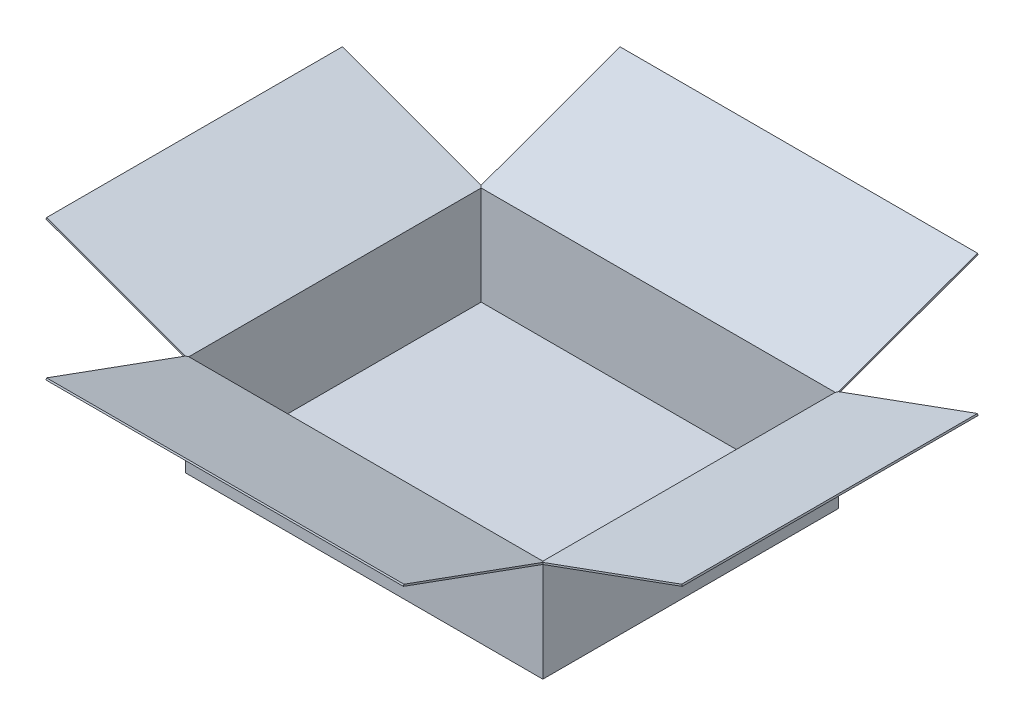
ISO-10303-21;
HEADER;
FILE_DESCRIPTION(('STEP AP214'),'2;1');
FILE_NAME('part.step','',(''),(''),'','','');
FILE_SCHEMA(('AUTOMOTIVE_DESIGN { 1 0 10303 214 1 1 1 1 }'));
ENDSEC;
DATA;
#1=APPLICATION_CONTEXT('core data for automotive mechanical design processes');
#2=APPLICATION_PROTOCOL_DEFINITION('international standard','automotive_design',2000,#1);
#3=PRODUCT_CONTEXT('',#1,'mechanical');
#4=PRODUCT('Part','Part','',(#3));
#5=PRODUCT_RELATED_PRODUCT_CATEGORY('part','',(#4));
#6=PRODUCT_DEFINITION_FORMATION('','',#4);
#7=PRODUCT_DEFINITION_CONTEXT('part definition',#1,'design');
#8=PRODUCT_DEFINITION('design','',#6,#7);
#9=PRODUCT_DEFINITION_SHAPE('','',#8);
#10=(LENGTH_UNIT() NAMED_UNIT(*) SI_UNIT(.MILLI.,.METRE.));
#11=(NAMED_UNIT(*) PLANE_ANGLE_UNIT() SI_UNIT($,.RADIAN.));
#12=(NAMED_UNIT(*) SI_UNIT($,.STERADIAN.) SOLID_ANGLE_UNIT());
#13=UNCERTAINTY_MEASURE_WITH_UNIT(LENGTH_MEASURE(1.E-05),#10,'distance_accuracy_value','');
#14=(GEOMETRIC_REPRESENTATION_CONTEXT(3) GLOBAL_UNCERTAINTY_ASSIGNED_CONTEXT((#13)) GLOBAL_UNIT_ASSIGNED_CONTEXT((#10,
#11,#12)) REPRESENTATION_CONTEXT('',''));
#15=CARTESIAN_POINT('',(0.,0.,0.));
#16=DIRECTION('',(0.,0.,1.));
#17=DIRECTION('',(1.,0.,0.));
#18=AXIS2_PLACEMENT_3D('',#15,#16,#17);
#19=CARTESIAN_POINT('',(-211.5,119.,175.));
#20=DIRECTION('',(1.,0.,0.));
#21=DIRECTION('',(0.,0.,-1.));
#22=AXIS2_PLACEMENT_3D('',#19,#20,#21);
#23=PLANE('',#22);
#24=DIRECTION('',(0.,0.,1.));
#25=VECTOR('',#24,1.);
#26=CARTESIAN_POINT('',(-211.5,117.599584923581,175.));
#27=LINE('',#26,#25);
#28=CARTESIAN_POINT('',(-211.5,117.599584923581,-175.));
#29=VERTEX_POINT('',#28);
#30=CARTESIAN_POINT('',(-211.5,117.599584923581,175.));
#31=VERTEX_POINT('',#30);
#32=EDGE_CURVE('E203',#29,#31,#27,.T.);
#33=ORIENTED_EDGE('',*,*,#32,.F.);
#34=DIRECTION('',(0.,-1.,0.));
#35=VECTOR('',#34,1.);
#36=CARTESIAN_POINT('',(-211.5,119.,-175.));
#37=LINE('',#36,#35);
#38=CARTESIAN_POINT('',(-211.5,0.,-175.));
#39=VERTEX_POINT('',#38);
#40=EDGE_CURVE('E320',#29,#39,#37,.T.);
#41=ORIENTED_EDGE('',*,*,#40,.T.);
#42=DIRECTION('',(0.,0.,1.));
#43=VECTOR('',#42,1.);
#44=CARTESIAN_POINT('',(-211.5,0.,175.));
#45=LINE('',#44,#43);
#46=CARTESIAN_POINT('',(-211.5,0.,175.));
#47=VERTEX_POINT('',#46);
#48=EDGE_CURVE('E312',#39,#47,#45,.T.);
#49=ORIENTED_EDGE('',*,*,#48,.T.);
#50=DIRECTION('',(0.,-1.,0.));
#51=VECTOR('',#50,1.);
#52=CARTESIAN_POINT('',(-211.5,119.,175.));
#53=LINE('',#52,#51);
#54=EDGE_CURVE('E318',#31,#47,#53,.T.);
#55=ORIENTED_EDGE('',*,*,#54,.F.);
#56=EDGE_LOOP('',(#33,#41,#49,#55));
#57=FACE_BOUND('',#56,.T.);
#58=ADVANCED_FACE('F36',(#57),#23,.F.);
#59=DIRECTION('',(0.,1.,0.));
#60=VECTOR('',#59,1.);
#61=CARTESIAN_POINT('',(-211.5,119.,175.));
#62=LINE('',#61,#60);
#63=CARTESIAN_POINT('',(-211.5,119.727940468532,175.));
#64=VERTEX_POINT('',#63);
#65=EDGE_CURVE('E200',#31,#64,#62,.T.);
#66=ORIENTED_EDGE('',*,*,#65,.F.);
#67=DIRECTION('',(0.,0.342020143325666,0.93969262078591));
#68=VECTOR('',#67,1.);
#69=CARTESIAN_POINT('',(-211.5,177.658180127071,340.009634165757));
#70=LINE('',#69,#68);
#71=CARTESIAN_POINT('',(-211.5,177.658180127071,340.009634165757));
#72=VERTEX_POINT('',#71);
#73=EDGE_CURVE('E258',#31,#72,#70,.T.);
#74=ORIENTED_EDGE('',*,*,#73,.T.);
#75=DIRECTION('',(0.,0.939692620785924,-0.342020143325626));
#76=VECTOR('',#75,1.);
#77=CARTESIAN_POINT('',(-211.5,179.537565368643,339.325593879106));
#78=LINE('',#77,#76);
#79=CARTESIAN_POINT('',(-211.5,179.537565368643,339.325593879106));
#80=VERTEX_POINT('',#79);
#81=EDGE_CURVE('E256',#72,#80,#78,.T.);
#82=ORIENTED_EDGE('',*,*,#81,.T.);
#83=DIRECTION('',(0.,-0.342020143325665,-0.93969262078591));
#84=VECTOR('',#83,1.);
#85=CARTESIAN_POINT('',(-211.5,119.,173.));
#86=LINE('',#85,#84);
#87=EDGE_CURVE('E261',#80,#64,#86,.T.);
#88=ORIENTED_EDGE('',*,*,#87,.T.);
#89=EDGE_LOOP('',(#66,#74,#82,#88));
#90=FACE_BOUND('',#89,.T.);
#91=ADVANCED_FACE('F424',(#90),#23,.F.);
#92=CARTESIAN_POINT('',(-389.792158065513,119.,173.));
#93=DIRECTION('',(0.,0.93969262078591,-0.342020143325665));
#94=DIRECTION('',(0.,0.342020143325665,0.93969262078591));
#95=AXIS2_PLACEMENT_3D('',#92,#93,#94);
#96=PLANE('',#95);
#97=DIRECTION('',(1.,0.,0.));
#98=VECTOR('',#97,1.);
#99=CARTESIAN_POINT('',(0.,119.,173.));
#100=LINE('',#99,#98);
#101=CARTESIAN_POINT('',(-209.5,119.,173.));
#102=VERTEX_POINT('',#101);
#103=CARTESIAN_POINT('',(209.5,119.,173.));
#104=VERTEX_POINT('',#103);
#105=EDGE_CURVE('E287',#102,#104,#100,.T.);
#106=ORIENTED_EDGE('',*,*,#105,.F.);
#107=DIRECTION('',(-0.684791078771737,0.249243569363952,0.684791078771736));
#108=VECTOR('',#107,1.);
#109=CARTESIAN_POINT('',(-294.045992140717,149.772224565725,257.545992140717));
#110=LINE('',#109,#108);
#111=EDGE_CURVE('E51',#102,#64,#110,.T.);
#112=ORIENTED_EDGE('',*,*,#111,.T.);
#113=ORIENTED_EDGE('',*,*,#87,.F.);
#114=DIRECTION('',(1.,0.,0.));
#115=VECTOR('',#114,1.);
#116=CARTESIAN_POINT('',(-389.792158065513,179.537565368643,339.325593879106));
#117=LINE('',#116,#115);
#118=CARTESIAN_POINT('',(211.5,179.537565368643,339.325593879106));
#119=VERTEX_POINT('',#118);
#120=EDGE_CURVE('E269',#80,#119,#117,.T.);
#121=ORIENTED_EDGE('',*,*,#120,.T.);
#122=DIRECTION('',(0.,0.342020143325665,0.93969262078591));
#123=VECTOR('',#122,1.);
#124=CARTESIAN_POINT('',(211.5,119.,173.));
#125=LINE('',#124,#123);
#126=CARTESIAN_POINT('',(211.499999999999,119.727940468532,175.));
#127=VERTEX_POINT('',#126);
#128=EDGE_CURVE('E255',#127,#119,#125,.T.);
#129=ORIENTED_EDGE('',*,*,#128,.F.);
#130=DIRECTION('',(0.684791078771737,0.249243569363952,0.684791078771736));
#131=VECTOR('',#130,1.);
#132=CARTESIAN_POINT('',(-71.5313583766025,16.7129506555201,-108.031358376602));
#133=LINE('',#132,#131);
#134=EDGE_CURVE('E326',#104,#127,#133,.T.);
#135=ORIENTED_EDGE('',*,*,#134,.F.);
#136=EDGE_LOOP('',(#106,#112,#113,#121,#129,#135));
#137=FACE_BOUND('',#136,.T.);
#138=ADVANCED_FACE('F350',(#137),#96,.T.);
#139=CARTESIAN_POINT('',(-389.792158065513,119.,-173.));
#140=DIRECTION('',(0.,-0.93969262078591,-0.342020143325665));
#141=DIRECTION('',(0.,0.342020143325665,-0.93969262078591));
#142=AXIS2_PLACEMENT_3D('',#139,#140,#141);
#143=PLANE('',#142);
#144=DIRECTION('',(-0.684791078771737,0.249243569363952,-0.684791078771736));
#145=VECTOR('',#144,1.);
#146=CARTESIAN_POINT('',(-294.045992140717,149.772224565725,-257.545992140717));
#147=LINE('',#146,#145);
#148=CARTESIAN_POINT('',(-209.5,119.,-173.));
#149=VERTEX_POINT('',#148);
#150=CARTESIAN_POINT('',(-211.5,119.727940468532,-175.));
#151=VERTEX_POINT('',#150);
#152=EDGE_CURVE('E11',#149,#151,#147,.T.);
#153=ORIENTED_EDGE('',*,*,#152,.F.);
#154=DIRECTION('',(-1.,0.,0.));
#155=VECTOR('',#154,1.);
#156=CARTESIAN_POINT('',(0.,119.,-173.));
#157=LINE('',#156,#155);
#158=CARTESIAN_POINT('',(209.5,119.,-173.));
#159=VERTEX_POINT('',#158);
#160=EDGE_CURVE('E300',#159,#149,#157,.T.);
#161=ORIENTED_EDGE('',*,*,#160,.F.);
#162=DIRECTION('',(-0.684791078771737,-0.249243569363952,0.684791078771736));
#163=VECTOR('',#162,1.);
#164=CARTESIAN_POINT('',(-37.2988244023312,29.1725740656612,73.7988244023313));
#165=LINE('',#164,#163);
#166=CARTESIAN_POINT('',(211.5,119.727940468532,-175.));
#167=VERTEX_POINT('',#166);
#168=EDGE_CURVE('E44',#167,#159,#165,.T.);
#169=ORIENTED_EDGE('',*,*,#168,.F.);
#170=DIRECTION('',(0.,0.342020143325665,-0.93969262078591));
#171=VECTOR('',#170,1.);
#172=CARTESIAN_POINT('',(211.5,119.,-173.));
#173=LINE('',#172,#171);
#174=CARTESIAN_POINT('',(211.5,179.537565368643,-339.325593879106));
#175=VERTEX_POINT('',#174);
#176=EDGE_CURVE('E218',#167,#175,#173,.T.);
#177=ORIENTED_EDGE('',*,*,#176,.T.);
#178=DIRECTION('',(1.,0.,0.));
#179=VECTOR('',#178,1.);
#180=CARTESIAN_POINT('',(-389.792158065513,179.537565368643,-339.325593879106));
#181=LINE('',#180,#179);
#182=CARTESIAN_POINT('',(-211.5,179.537565368643,-339.325593879106));
#183=VERTEX_POINT('',#182);
#184=EDGE_CURVE('E221',#183,#175,#181,.T.);
#185=ORIENTED_EDGE('',*,*,#184,.F.);
#186=DIRECTION('',(0.,-0.342020143325665,0.93969262078591));
#187=VECTOR('',#186,1.);
#188=CARTESIAN_POINT('',(-211.5,119.,-173.));
#189=LINE('',#188,#187);
#190=EDGE_CURVE('E209',#183,#151,#189,.T.);
#191=ORIENTED_EDGE('',*,*,#190,.T.);
#192=EDGE_LOOP('',(#153,#161,#169,#177,#185,#191));
#193=FACE_BOUND('',#192,.T.);
#194=ADVANCED_FACE('F408',(#193),#143,.F.);
#195=CARTESIAN_POINT('',(-211.5,119.,-175.));
#196=DIRECTION('',(0.,0.,1.));
#197=DIRECTION('',(1.,0.,0.));
#198=AXIS2_PLACEMENT_3D('',#195,#196,#197);
#199=PLANE('',#198);
#200=ORIENTED_EDGE('',*,*,#40,.F.);
#201=DIRECTION('',(-1.,0.,0.));
#202=VECTOR('',#201,1.);
#203=CARTESIAN_POINT('',(-211.5,117.599584923581,-175.));
#204=LINE('',#203,#202);
#205=CARTESIAN_POINT('',(211.5,117.599584923581,-175.));
#206=VERTEX_POINT('',#205);
#207=EDGE_CURVE('E228',#206,#29,#204,.T.);
#208=ORIENTED_EDGE('',*,*,#207,.F.);
#209=DIRECTION('',(0.,-1.,0.));
#210=VECTOR('',#209,1.);
#211=CARTESIAN_POINT('',(211.5,119.,-175.));
#212=LINE('',#211,#210);
#213=CARTESIAN_POINT('',(211.5,0.,-175.));
#214=VERTEX_POINT('',#213);
#215=EDGE_CURVE('E322',#206,#214,#212,.T.);
#216=ORIENTED_EDGE('',*,*,#215,.T.);
#217=DIRECTION('',(-1.,0.,0.));
#218=VECTOR('',#217,1.);
#219=CARTESIAN_POINT('',(-211.5,0.,-175.));
#220=LINE('',#219,#218);
#221=EDGE_CURVE('E309',#214,#39,#220,.T.);
#222=ORIENTED_EDGE('',*,*,#221,.T.);
#223=EDGE_LOOP('',(#200,#208,#216,#222));
#224=FACE_BOUND('',#223,.T.);
#225=ADVANCED_FACE('F390',(#224),#199,.F.);
#226=CARTESIAN_POINT('',(209.5,119.,353.292158065513));
#227=DIRECTION('',(-0.342020143325665,0.93969262078591,0.));
#228=DIRECTION('',(-0.93969262078591,-0.342020143325665,0.));
#229=AXIS2_PLACEMENT_3D('',#226,#227,#228);
#230=PLANE('',#229);
#231=DIRECTION('',(0.93969262078591,0.342020143325665,0.));
#232=VECTOR('',#231,1.);
#233=CARTESIAN_POINT('',(209.5,119.,-175.));
#234=LINE('',#233,#232);
#235=CARTESIAN_POINT('',(375.825593879106,179.537565368643,-175.));
#236=VERTEX_POINT('',#235);
#237=EDGE_CURVE('E230',#167,#236,#234,.T.);
#238=ORIENTED_EDGE('',*,*,#237,.F.);
#239=ORIENTED_EDGE('',*,*,#168,.T.);
#240=DIRECTION('',(0.,0.,-1.));
#241=VECTOR('',#240,1.);
#242=CARTESIAN_POINT('',(209.5,119.,0.));
#243=LINE('',#242,#241);
#244=EDGE_CURVE('E297',#104,#159,#243,.T.);
#245=ORIENTED_EDGE('',*,*,#244,.F.);
#246=ORIENTED_EDGE('',*,*,#134,.T.);
#247=DIRECTION('',(-0.93969262078591,-0.342020143325665,0.));
#248=VECTOR('',#247,1.);
#249=CARTESIAN_POINT('',(209.5,119.,175.));
#250=LINE('',#249,#248);
#251=CARTESIAN_POINT('',(375.825593879106,179.537565368643,175.));
#252=VERTEX_POINT('',#251);
#253=EDGE_CURVE('E236',#252,#127,#250,.T.);
#254=ORIENTED_EDGE('',*,*,#253,.F.);
#255=DIRECTION('',(0.,0.,-1.));
#256=VECTOR('',#255,1.);
#257=CARTESIAN_POINT('',(375.825593879106,179.537565368643,353.292158065513));
#258=LINE('',#257,#256);
#259=EDGE_CURVE('E244',#252,#236,#258,.T.);
#260=ORIENTED_EDGE('',*,*,#259,.T.);
#261=EDGE_LOOP('',(#238,#239,#245,#246,#254,#260));
#262=FACE_BOUND('',#261,.T.);
#263=ADVANCED_FACE('F332',(#262),#230,.T.);
#264=CARTESIAN_POINT('',(211.5,119.,175.));
#265=DIRECTION('',(-1.,0.,0.));
#266=DIRECTION('',(0.,0.,1.));
#267=AXIS2_PLACEMENT_3D('',#264,#265,#266);
#268=PLANE('',#267);
#269=DIRECTION('',(0.,-1.,0.));
#270=VECTOR('',#269,1.);
#271=CARTESIAN_POINT('',(211.5,119.,175.));
#272=LINE('',#271,#270);
#273=CARTESIAN_POINT('',(211.5,117.599584923581,175.));
#274=VERTEX_POINT('',#273);
#275=EDGE_CURVE('E250',#127,#274,#272,.T.);
#276=ORIENTED_EDGE('',*,*,#275,.F.);
#277=ORIENTED_EDGE('',*,*,#128,.T.);
#278=DIRECTION('',(0.,-0.939692620785924,0.342020143325626));
#279=VECTOR('',#278,1.);
#280=CARTESIAN_POINT('',(211.5,179.537565368643,339.325593879106));
#281=LINE('',#280,#279);
#282=CARTESIAN_POINT('',(211.5,177.658180127071,340.009634165757));
#283=VERTEX_POINT('',#282);
#284=EDGE_CURVE('E263',#119,#283,#281,.T.);
#285=ORIENTED_EDGE('',*,*,#284,.T.);
#286=DIRECTION('',(0.,-0.342020143325666,-0.93969262078591));
#287=VECTOR('',#286,1.);
#288=CARTESIAN_POINT('',(211.5,177.658180127071,340.009634165757));
#289=LINE('',#288,#287);
#290=EDGE_CURVE('E266',#283,#274,#289,.T.);
#291=ORIENTED_EDGE('',*,*,#290,.T.);
#292=EDGE_LOOP('',(#276,#277,#285,#291));
#293=FACE_BOUND('',#292,.T.);
#294=ADVANCED_FACE('F379',(#293),#268,.F.);
#295=ORIENTED_EDGE('',*,*,#215,.F.);
#296=DIRECTION('',(0.,0.,1.));
#297=VECTOR('',#296,1.);
#298=CARTESIAN_POINT('',(211.5,117.599584923581,175.));
#299=LINE('',#298,#297);
#300=EDGE_CURVE('E253',#206,#274,#299,.T.);
#301=ORIENTED_EDGE('',*,*,#300,.T.);
#302=DIRECTION('',(0.,-1.,0.));
#303=VECTOR('',#302,1.);
#304=CARTESIAN_POINT('',(211.5,119.,175.));
#305=LINE('',#304,#303);
#306=CARTESIAN_POINT('',(211.5,0.,175.));
#307=VERTEX_POINT('',#306);
#308=EDGE_CURVE('E59',#274,#307,#305,.T.);
#309=ORIENTED_EDGE('',*,*,#308,.T.);
#310=DIRECTION('',(0.,0.,-1.));
#311=VECTOR('',#310,1.);
#312=CARTESIAN_POINT('',(211.5,0.,175.));
#313=LINE('',#312,#311);
#314=EDGE_CURVE('E281',#307,#214,#313,.T.);
#315=ORIENTED_EDGE('',*,*,#314,.T.);
#316=EDGE_LOOP('',(#295,#301,#309,#315));
#317=FACE_BOUND('',#316,.T.);
#318=ADVANCED_FACE('F38',(#317),#268,.F.);
#319=DIRECTION('',(-0.93969262078591,-0.342020143325666,0.));
#320=VECTOR('',#319,1.);
#321=CARTESIAN_POINT('',(376.509634165757,177.658180127071,-175.));
#322=LINE('',#321,#320);
#323=CARTESIAN_POINT('',(376.509634165757,177.658180127071,-175.));
#324=VERTEX_POINT('',#323);
#325=EDGE_CURVE('E241',#324,#206,#322,.T.);
#326=ORIENTED_EDGE('',*,*,#325,.T.);
#327=DIRECTION('',(0.,1.,0.));
#328=VECTOR('',#327,1.);
#329=CARTESIAN_POINT('',(211.5,119.,-175.));
#330=LINE('',#329,#328);
#331=EDGE_CURVE('E212',#206,#167,#330,.T.);
#332=ORIENTED_EDGE('',*,*,#331,.T.);
#333=ORIENTED_EDGE('',*,*,#237,.T.);
#334=DIRECTION('',(0.342020143325664,-0.93969262078591,0.));
#335=VECTOR('',#334,1.);
#336=CARTESIAN_POINT('',(375.825593879106,179.537565368643,-175.));
#337=LINE('',#336,#335);
#338=EDGE_CURVE('E238',#236,#324,#337,.T.);
#339=ORIENTED_EDGE('',*,*,#338,.T.);
#340=EDGE_LOOP('',(#326,#332,#333,#339));
#341=FACE_BOUND('',#340,.T.);
#342=ADVANCED_FACE('F364',(#341),#199,.F.);
#343=DIRECTION('',(0.,0.342020143325666,-0.93969262078591));
#344=VECTOR('',#343,1.);
#345=CARTESIAN_POINT('',(-211.5,177.658180127071,-340.009634165757));
#346=LINE('',#345,#344);
#347=CARTESIAN_POINT('',(-211.5,177.658180127071,-340.009634165757));
#348=VERTEX_POINT('',#347);
#349=EDGE_CURVE('E210',#29,#348,#346,.T.);
#350=ORIENTED_EDGE('',*,*,#349,.F.);
#351=DIRECTION('',(0.,1.,0.));
#352=VECTOR('',#351,1.);
#353=CARTESIAN_POINT('',(-211.5,119.,-175.));
#354=LINE('',#353,#352);
#355=EDGE_CURVE('E188',#29,#151,#354,.T.);
#356=ORIENTED_EDGE('',*,*,#355,.T.);
#357=ORIENTED_EDGE('',*,*,#190,.F.);
#358=DIRECTION('',(0.,0.939692620785924,0.342020143325626));
#359=VECTOR('',#358,1.);
#360=CARTESIAN_POINT('',(-211.5,179.537565368643,-339.325593879106));
#361=LINE('',#360,#359);
#362=EDGE_CURVE('E206',#348,#183,#361,.T.);
#363=ORIENTED_EDGE('',*,*,#362,.F.);
#364=EDGE_LOOP('',(#350,#356,#357,#363));
#365=FACE_BOUND('',#364,.T.);
#366=ADVANCED_FACE('F400',(#365),#23,.F.);
#367=CARTESIAN_POINT('',(-211.5,119.,175.));
#368=DIRECTION('',(0.,0.,-1.));
#369=DIRECTION('',(-1.,0.,0.));
#370=AXIS2_PLACEMENT_3D('',#367,#368,#369);
#371=PLANE('',#370);
#372=DIRECTION('',(-1.,0.,0.));
#373=VECTOR('',#372,1.);
#374=CARTESIAN_POINT('',(-211.5,117.599584923581,175.));
#375=LINE('',#374,#373);
#376=EDGE_CURVE('E324',#274,#31,#375,.T.);
#377=ORIENTED_EDGE('',*,*,#376,.T.);
#378=ORIENTED_EDGE('',*,*,#54,.T.);
#379=DIRECTION('',(1.,0.,0.));
#380=VECTOR('',#379,1.);
#381=CARTESIAN_POINT('',(-211.5,0.,175.));
#382=LINE('',#381,#380);
#383=EDGE_CURVE('E315',#47,#307,#382,.T.);
#384=ORIENTED_EDGE('',*,*,#383,.T.);
#385=ORIENTED_EDGE('',*,*,#308,.F.);
#386=EDGE_LOOP('',(#377,#378,#384,#385));
#387=FACE_BOUND('',#386,.T.);
#388=ADVANCED_FACE('F381',(#387),#371,.F.);
#389=CARTESIAN_POINT('',(0.,0.,0.));
#390=DIRECTION('',(0.,-1.,0.));
#391=DIRECTION('',(0.,0.,-1.));
#392=AXIS2_PLACEMENT_3D('',#389,#390,#391);
#393=PLANE('',#392);
#394=ORIENTED_EDGE('',*,*,#314,.F.);
#395=ORIENTED_EDGE('',*,*,#383,.F.);
#396=ORIENTED_EDGE('',*,*,#48,.F.);
#397=ORIENTED_EDGE('',*,*,#221,.F.);
#398=EDGE_LOOP('',(#394,#395,#396,#397));
#399=FACE_BOUND('',#398,.T.);
#400=ADVANCED_FACE('F387',(#399),#393,.T.);
#401=CARTESIAN_POINT('',(209.5,119.,175.));
#402=DIRECTION('',(-1.,0.,0.));
#403=DIRECTION('',(0.,0.,1.));
#404=AXIS2_PLACEMENT_3D('',#401,#402,#403);
#405=PLANE('',#404);
#406=DIRECTION('',(0.,0.,-1.));
#407=VECTOR('',#406,1.);
#408=CARTESIAN_POINT('',(209.5,2.,0.));
#409=LINE('',#408,#407);
#410=CARTESIAN_POINT('',(209.5,2.,173.));
#411=VERTEX_POINT('',#410);
#412=CARTESIAN_POINT('',(209.5,2.,-173.));
#413=VERTEX_POINT('',#412);
#414=EDGE_CURVE('E274',#411,#413,#409,.T.);
#415=ORIENTED_EDGE('',*,*,#414,.F.);
#416=DIRECTION('',(0.,-1.,0.));
#417=VECTOR('',#416,1.);
#418=CARTESIAN_POINT('',(209.5,119.,173.));
#419=LINE('',#418,#417);
#420=EDGE_CURVE('E283',#104,#411,#419,.T.);
#421=ORIENTED_EDGE('',*,*,#420,.F.);
#422=ORIENTED_EDGE('',*,*,#244,.T.);
#423=DIRECTION('',(0.,-1.,0.));
#424=VECTOR('',#423,1.);
#425=CARTESIAN_POINT('',(209.5,119.,-173.));
#426=LINE('',#425,#424);
#427=EDGE_CURVE('E278',#159,#413,#426,.T.);
#428=ORIENTED_EDGE('',*,*,#427,.T.);
#429=EDGE_LOOP('',(#415,#421,#422,#428));
#430=FACE_BOUND('',#429,.T.);
#431=ADVANCED_FACE('F339',(#430),#405,.T.);
#432=CARTESIAN_POINT('',(-211.5,119.,-173.));
#433=DIRECTION('',(0.,0.,1.));
#434=DIRECTION('',(1.,0.,0.));
#435=AXIS2_PLACEMENT_3D('',#432,#433,#434);
#436=PLANE('',#435);
#437=DIRECTION('',(-1.,0.,0.));
#438=VECTOR('',#437,1.);
#439=CARTESIAN_POINT('',(0.,2.,-173.));
#440=LINE('',#439,#438);
#441=CARTESIAN_POINT('',(-209.5,2.,-173.));
#442=VERTEX_POINT('',#441);
#443=EDGE_CURVE('E277',#413,#442,#440,.T.);
#444=ORIENTED_EDGE('',*,*,#443,.F.);
#445=ORIENTED_EDGE('',*,*,#427,.F.);
#446=ORIENTED_EDGE('',*,*,#160,.T.);
#447=DIRECTION('',(0.,-1.,0.));
#448=VECTOR('',#447,1.);
#449=CARTESIAN_POINT('',(-209.5,119.,-173.));
#450=LINE('',#449,#448);
#451=EDGE_CURVE('E282',#149,#442,#450,.T.);
#452=ORIENTED_EDGE('',*,*,#451,.T.);
#453=EDGE_LOOP('',(#444,#445,#446,#452));
#454=FACE_BOUND('',#453,.T.);
#455=ADVANCED_FACE('F341',(#454),#436,.T.);
#456=CARTESIAN_POINT('',(-209.5,119.,175.));
#457=DIRECTION('',(1.,0.,0.));
#458=DIRECTION('',(0.,0.,-1.));
#459=AXIS2_PLACEMENT_3D('',#456,#457,#458);
#460=PLANE('',#459);
#461=DIRECTION('',(0.,0.,1.));
#462=VECTOR('',#461,1.);
#463=CARTESIAN_POINT('',(-209.5,2.,0.));
#464=LINE('',#463,#462);
#465=CARTESIAN_POINT('',(-209.5,2.,173.));
#466=VERTEX_POINT('',#465);
#467=EDGE_CURVE('E289',#442,#466,#464,.T.);
#468=ORIENTED_EDGE('',*,*,#467,.F.);
#469=ORIENTED_EDGE('',*,*,#451,.F.);
#470=DIRECTION('',(0.,0.,1.));
#471=VECTOR('',#470,1.);
#472=CARTESIAN_POINT('',(-209.5,119.,0.));
#473=LINE('',#472,#471);
#474=EDGE_CURVE('E303',#149,#102,#473,.T.);
#475=ORIENTED_EDGE('',*,*,#474,.T.);
#476=DIRECTION('',(0.,-1.,0.));
#477=VECTOR('',#476,1.);
#478=CARTESIAN_POINT('',(-209.5,119.,173.));
#479=LINE('',#478,#477);
#480=EDGE_CURVE('E286',#102,#466,#479,.T.);
#481=ORIENTED_EDGE('',*,*,#480,.T.);
#482=EDGE_LOOP('',(#468,#469,#475,#481));
#483=FACE_BOUND('',#482,.T.);
#484=ADVANCED_FACE('F414',(#483),#460,.T.);
#485=CARTESIAN_POINT('',(-211.5,119.,173.));
#486=DIRECTION('',(0.,0.,-1.));
#487=DIRECTION('',(-1.,0.,0.));
#488=AXIS2_PLACEMENT_3D('',#485,#486,#487);
#489=PLANE('',#488);
#490=DIRECTION('',(1.,0.,0.));
#491=VECTOR('',#490,1.);
#492=CARTESIAN_POINT('',(0.,2.,173.));
#493=LINE('',#492,#491);
#494=EDGE_CURVE('E293',#466,#411,#493,.T.);
#495=ORIENTED_EDGE('',*,*,#494,.F.);
#496=ORIENTED_EDGE('',*,*,#480,.F.);
#497=ORIENTED_EDGE('',*,*,#105,.T.);
#498=ORIENTED_EDGE('',*,*,#420,.T.);
#499=EDGE_LOOP('',(#495,#496,#497,#498));
#500=FACE_BOUND('',#499,.T.);
#501=ADVANCED_FACE('F349',(#500),#489,.T.);
#502=CARTESIAN_POINT('',(0.,2.,0.));
#503=DIRECTION('',(0.,-1.,0.));
#504=DIRECTION('',(0.,0.,-1.));
#505=AXIS2_PLACEMENT_3D('',#502,#503,#504);
#506=PLANE('',#505);
#507=ORIENTED_EDGE('',*,*,#414,.T.);
#508=ORIENTED_EDGE('',*,*,#443,.T.);
#509=ORIENTED_EDGE('',*,*,#467,.T.);
#510=ORIENTED_EDGE('',*,*,#494,.T.);
#511=EDGE_LOOP('',(#507,#508,#509,#510));
#512=FACE_BOUND('',#511,.T.);
#513=ADVANCED_FACE('F345',(#512),#506,.F.);
#514=CARTESIAN_POINT('',(-389.792158065513,177.658180127071,340.009634165757));
#515=DIRECTION('',(0.,-0.93969262078591,0.342020143325666));
#516=DIRECTION('',(0.,-0.342020143325666,-0.93969262078591));
#517=AXIS2_PLACEMENT_3D('',#514,#515,#516);
#518=PLANE('',#517);
#519=ORIENTED_EDGE('',*,*,#376,.F.);
#520=ORIENTED_EDGE('',*,*,#290,.F.);
#521=DIRECTION('',(1.,0.,0.));
#522=VECTOR('',#521,1.);
#523=CARTESIAN_POINT('',(-389.792158065513,177.658180127071,340.009634165757));
#524=LINE('',#523,#522);
#525=EDGE_CURVE('E259',#72,#283,#524,.T.);
#526=ORIENTED_EDGE('',*,*,#525,.F.);
#527=ORIENTED_EDGE('',*,*,#73,.F.);
#528=EDGE_LOOP('',(#519,#520,#526,#527));
#529=FACE_BOUND('',#528,.T.);
#530=ADVANCED_FACE('F373',(#529),#518,.T.);
#531=CARTESIAN_POINT('',(-389.792158065513,179.537565368643,339.325593879106));
#532=DIRECTION('',(0.,0.342020143325626,0.939692620785924));
#533=DIRECTION('',(0.,-0.939692620785924,0.342020143325626));
#534=AXIS2_PLACEMENT_3D('',#531,#532,#533);
#535=PLANE('',#534);
#536=ORIENTED_EDGE('',*,*,#81,.F.);
#537=ORIENTED_EDGE('',*,*,#525,.T.);
#538=ORIENTED_EDGE('',*,*,#284,.F.);
#539=ORIENTED_EDGE('',*,*,#120,.F.);
#540=EDGE_LOOP('',(#536,#537,#538,#539));
#541=FACE_BOUND('',#540,.T.);
#542=ADVANCED_FACE('F461',(#541),#535,.T.);
#543=CARTESIAN_POINT('',(376.509634165757,177.658180127071,353.292158065513));
#544=DIRECTION('',(0.342020143325666,-0.93969262078591,0.));
#545=DIRECTION('',(0.93969262078591,0.342020143325666,0.));
#546=AXIS2_PLACEMENT_3D('',#543,#544,#545);
#547=PLANE('',#546);
#548=ORIENTED_EDGE('',*,*,#300,.F.);
#549=ORIENTED_EDGE('',*,*,#325,.F.);
#550=DIRECTION('',(0.,0.,-1.));
#551=VECTOR('',#550,1.);
#552=CARTESIAN_POINT('',(376.509634165757,177.658180127071,353.292158065513));
#553=LINE('',#552,#551);
#554=CARTESIAN_POINT('',(376.509634165757,177.658180127071,175.));
#555=VERTEX_POINT('',#554);
#556=EDGE_CURVE('E234',#555,#324,#553,.T.);
#557=ORIENTED_EDGE('',*,*,#556,.F.);
#558=DIRECTION('',(0.93969262078591,0.342020143325666,0.));
#559=VECTOR('',#558,1.);
#560=CARTESIAN_POINT('',(376.509634165757,177.658180127071,175.));
#561=LINE('',#560,#559);
#562=EDGE_CURVE('E233',#274,#555,#561,.T.);
#563=ORIENTED_EDGE('',*,*,#562,.F.);
#564=EDGE_LOOP('',(#548,#549,#557,#563));
#565=FACE_BOUND('',#564,.T.);
#566=ADVANCED_FACE('F367',(#565),#547,.T.);
#567=CARTESIAN_POINT('',(-211.5,119.,175.));
#568=DIRECTION('',(0.,0.,-1.));
#569=DIRECTION('',(-1.,0.,0.));
#570=AXIS2_PLACEMENT_3D('',#567,#568,#569);
#571=PLANE('',#570);
#572=ORIENTED_EDGE('',*,*,#253,.T.);
#573=ORIENTED_EDGE('',*,*,#275,.T.);
#574=ORIENTED_EDGE('',*,*,#562,.T.);
#575=DIRECTION('',(-0.342020143325664,0.93969262078591,0.));
#576=VECTOR('',#575,1.);
#577=CARTESIAN_POINT('',(375.825593879106,179.537565368643,175.));
#578=LINE('',#577,#576);
#579=EDGE_CURVE('E231',#555,#252,#578,.T.);
#580=ORIENTED_EDGE('',*,*,#579,.T.);
#581=EDGE_LOOP('',(#572,#573,#574,#580));
#582=FACE_BOUND('',#581,.T.);
#583=ADVANCED_FACE('F354',(#582),#571,.F.);
#584=CARTESIAN_POINT('',(375.825593879106,179.537565368643,353.292158065513));
#585=DIRECTION('',(0.93969262078591,0.342020143325664,0.));
#586=DIRECTION('',(-0.342020143325664,0.93969262078591,0.));
#587=AXIS2_PLACEMENT_3D('',#584,#585,#586);
#588=PLANE('',#587);
#589=ORIENTED_EDGE('',*,*,#579,.F.);
#590=ORIENTED_EDGE('',*,*,#556,.T.);
#591=ORIENTED_EDGE('',*,*,#338,.F.);
#592=ORIENTED_EDGE('',*,*,#259,.F.);
#593=EDGE_LOOP('',(#589,#590,#591,#592));
#594=FACE_BOUND('',#593,.T.);
#595=ADVANCED_FACE('F361',(#594),#588,.T.);
#596=CARTESIAN_POINT('',(-389.792158065513,177.658180127071,-340.009634165757));
#597=DIRECTION('',(0.,0.93969262078591,0.342020143325666));
#598=DIRECTION('',(0.,-0.342020143325666,0.93969262078591));
#599=AXIS2_PLACEMENT_3D('',#596,#597,#598);
#600=PLANE('',#599);
#601=DIRECTION('',(0.,-0.342020143325666,0.93969262078591));
#602=VECTOR('',#601,1.);
#603=CARTESIAN_POINT('',(211.5,177.658180127071,-340.009634165757));
#604=LINE('',#603,#602);
#605=CARTESIAN_POINT('',(211.5,177.658180127071,-340.009634165757));
#606=VERTEX_POINT('',#605);
#607=EDGE_CURVE('E205',#606,#206,#604,.T.);
#608=ORIENTED_EDGE('',*,*,#607,.T.);
#609=ORIENTED_EDGE('',*,*,#207,.T.);
#610=ORIENTED_EDGE('',*,*,#349,.T.);
#611=DIRECTION('',(1.,0.,0.));
#612=VECTOR('',#611,1.);
#613=CARTESIAN_POINT('',(-389.792158065513,177.658180127071,-340.009634165757));
#614=LINE('',#613,#612);
#615=EDGE_CURVE('E220',#348,#606,#614,.T.);
#616=ORIENTED_EDGE('',*,*,#615,.T.);
#617=EDGE_LOOP('',(#608,#609,#610,#616));
#618=FACE_BOUND('',#617,.T.);
#619=ADVANCED_FACE('F394',(#618),#600,.F.);
#620=CARTESIAN_POINT('',(211.5,0.,0.));
#621=DIRECTION('',(1.,0.,0.));
#622=DIRECTION('',(0.,0.,1.));
#623=AXIS2_PLACEMENT_3D('',#620,#621,#622);
#624=PLANE('',#623);
#625=ORIENTED_EDGE('',*,*,#331,.F.);
#626=ORIENTED_EDGE('',*,*,#607,.F.);
#627=DIRECTION('',(0.,-0.939692620785924,-0.342020143325626));
#628=VECTOR('',#627,1.);
#629=CARTESIAN_POINT('',(211.5,179.537565368643,-339.325593879106));
#630=LINE('',#629,#628);
#631=EDGE_CURVE('E215',#175,#606,#630,.T.);
#632=ORIENTED_EDGE('',*,*,#631,.F.);
#633=ORIENTED_EDGE('',*,*,#176,.F.);
#634=EDGE_LOOP('',(#625,#626,#632,#633));
#635=FACE_BOUND('',#634,.T.);
#636=ADVANCED_FACE('F407',(#635),#624,.T.);
#637=CARTESIAN_POINT('',(-389.792158065513,179.537565368643,-339.325593879106));
#638=DIRECTION('',(0.,-0.342020143325626,0.939692620785924));
#639=DIRECTION('',(0.,-0.939692620785924,-0.342020143325626));
#640=AXIS2_PLACEMENT_3D('',#637,#638,#639);
#641=PLANE('',#640);
#642=ORIENTED_EDGE('',*,*,#615,.F.);
#643=ORIENTED_EDGE('',*,*,#362,.T.);
#644=ORIENTED_EDGE('',*,*,#184,.T.);
#645=ORIENTED_EDGE('',*,*,#631,.T.);
#646=EDGE_LOOP('',(#642,#643,#644,#645));
#647=FACE_BOUND('',#646,.T.);
#648=ADVANCED_FACE('F404',(#647),#641,.F.);
#649=CARTESIAN_POINT('',(-376.509634165757,177.658180127071,353.292158065513));
#650=DIRECTION('',(0.342020143325666,0.93969262078591,0.));
#651=DIRECTION('',(-0.93969262078591,0.342020143325666,0.));
#652=AXIS2_PLACEMENT_3D('',#649,#650,#651);
#653=PLANE('',#652);
#654=DIRECTION('',(0.93969262078591,-0.342020143325666,0.));
#655=VECTOR('',#654,1.);
#656=CARTESIAN_POINT('',(-376.509634165757,177.658180127071,-175.));
#657=LINE('',#656,#655);
#658=CARTESIAN_POINT('',(-376.509634165757,177.658180127071,-175.));
#659=VERTEX_POINT('',#658);
#660=EDGE_CURVE('E168',#659,#29,#657,.T.);
#661=ORIENTED_EDGE('',*,*,#660,.T.);
#662=ORIENTED_EDGE('',*,*,#32,.T.);
#663=DIRECTION('',(-0.93969262078591,0.342020143325666,0.));
#664=VECTOR('',#663,1.);
#665=CARTESIAN_POINT('',(-376.509634165757,177.658180127071,175.));
#666=LINE('',#665,#664);
#667=CARTESIAN_POINT('',(-376.509634165757,177.658180127071,175.));
#668=VERTEX_POINT('',#667);
#669=EDGE_CURVE('E170',#31,#668,#666,.T.);
#670=ORIENTED_EDGE('',*,*,#669,.T.);
#671=DIRECTION('',(0.,0.,-1.));
#672=VECTOR('',#671,1.);
#673=CARTESIAN_POINT('',(-376.509634165757,177.658180127071,353.292158065513));
#674=LINE('',#673,#672);
#675=EDGE_CURVE('E163',#668,#659,#674,.T.);
#676=ORIENTED_EDGE('',*,*,#675,.T.);
#677=EDGE_LOOP('',(#661,#662,#670,#676));
#678=FACE_BOUND('',#677,.T.);
#679=ADVANCED_FACE('F165',(#678),#653,.F.);
#680=CARTESIAN_POINT('',(-211.5,119.,175.));
#681=DIRECTION('',(0.,0.,-1.));
#682=DIRECTION('',(-1.,0.,0.));
#683=AXIS2_PLACEMENT_3D('',#680,#681,#682);
#684=PLANE('',#683);
#685=ORIENTED_EDGE('',*,*,#669,.F.);
#686=ORIENTED_EDGE('',*,*,#65,.T.);
#687=DIRECTION('',(0.93969262078591,-0.342020143325665,0.));
#688=VECTOR('',#687,1.);
#689=CARTESIAN_POINT('',(-209.5,119.,175.));
#690=LINE('',#689,#688);
#691=CARTESIAN_POINT('',(-375.825593879106,179.537565368643,175.));
#692=VERTEX_POINT('',#691);
#693=EDGE_CURVE('E191',#692,#64,#690,.T.);
#694=ORIENTED_EDGE('',*,*,#693,.F.);
#695=DIRECTION('',(0.342020143325664,0.93969262078591,0.));
#696=VECTOR('',#695,1.);
#697=CARTESIAN_POINT('',(-375.825593879106,179.537565368643,175.));
#698=LINE('',#697,#696);
#699=EDGE_CURVE('E197',#668,#692,#698,.T.);
#700=ORIENTED_EDGE('',*,*,#699,.F.);
#701=EDGE_LOOP('',(#685,#686,#694,#700));
#702=FACE_BOUND('',#701,.T.);
#703=ADVANCED_FACE('F521',(#702),#684,.F.);
#704=CARTESIAN_POINT('',(0.,0.,-175.));
#705=DIRECTION('',(0.,0.,-1.));
#706=DIRECTION('',(1.,0.,0.));
#707=AXIS2_PLACEMENT_3D('',#704,#705,#706);
#708=PLANE('',#707);
#709=ORIENTED_EDGE('',*,*,#355,.F.);
#710=ORIENTED_EDGE('',*,*,#660,.F.);
#711=DIRECTION('',(-0.342020143325664,-0.93969262078591,0.));
#712=VECTOR('',#711,1.);
#713=CARTESIAN_POINT('',(-375.825593879106,179.537565368643,-175.));
#714=LINE('',#713,#712);
#715=CARTESIAN_POINT('',(-375.825593879106,179.537565368643,-175.));
#716=VERTEX_POINT('',#715);
#717=EDGE_CURVE('E179',#716,#659,#714,.T.);
#718=ORIENTED_EDGE('',*,*,#717,.F.);
#719=DIRECTION('',(-0.93969262078591,0.342020143325665,0.));
#720=VECTOR('',#719,1.);
#721=CARTESIAN_POINT('',(-209.5,119.,-175.));
#722=LINE('',#721,#720);
#723=EDGE_CURVE('E175',#151,#716,#722,.T.);
#724=ORIENTED_EDGE('',*,*,#723,.F.);
#725=EDGE_LOOP('',(#709,#710,#718,#724));
#726=FACE_BOUND('',#725,.T.);
#727=ADVANCED_FACE('F186',(#726),#708,.T.);
#728=CARTESIAN_POINT('',(-209.5,119.,353.292158065513));
#729=DIRECTION('',(-0.342020143325665,-0.93969262078591,0.));
#730=DIRECTION('',(0.93969262078591,-0.342020143325665,0.));
#731=AXIS2_PLACEMENT_3D('',#728,#729,#730);
#732=PLANE('',#731);
#733=ORIENTED_EDGE('',*,*,#111,.F.);
#734=ORIENTED_EDGE('',*,*,#474,.F.);
#735=ORIENTED_EDGE('',*,*,#152,.T.);
#736=ORIENTED_EDGE('',*,*,#723,.T.);
#737=DIRECTION('',(0.,0.,-1.));
#738=VECTOR('',#737,1.);
#739=CARTESIAN_POINT('',(-375.825593879106,179.537565368643,353.292158065513));
#740=LINE('',#739,#738);
#741=EDGE_CURVE('E174',#692,#716,#740,.T.);
#742=ORIENTED_EDGE('',*,*,#741,.F.);
#743=ORIENTED_EDGE('',*,*,#693,.T.);
#744=EDGE_LOOP('',(#733,#734,#735,#736,#742,#743));
#745=FACE_BOUND('',#744,.T.);
#746=ADVANCED_FACE('F411',(#745),#732,.F.);
#747=CARTESIAN_POINT('',(-375.825593879106,179.537565368643,353.292158065513));
#748=DIRECTION('',(0.93969262078591,-0.342020143325664,0.));
#749=DIRECTION('',(0.342020143325664,0.93969262078591,0.));
#750=AXIS2_PLACEMENT_3D('',#747,#748,#749);
#751=PLANE('',#750);
#752=ORIENTED_EDGE('',*,*,#675,.F.);
#753=ORIENTED_EDGE('',*,*,#699,.T.);
#754=ORIENTED_EDGE('',*,*,#741,.T.);
#755=ORIENTED_EDGE('',*,*,#717,.T.);
#756=EDGE_LOOP('',(#752,#753,#754,#755));
#757=FACE_BOUND('',#756,.T.);
#758=ADVANCED_FACE('F180',(#757),#751,.F.);
#759=CLOSED_SHELL('',(#58,#91,#138,#194,#225,#263,#294,#318,#342,#366,#388,#400,#431,#455,#484,
#501,#513,#530,#542,#566,#583,#595,#619,#636,#648,#679,#703,#727,#746,#758));
#760=MANIFOLD_SOLID_BREP('B2',#759);
#761=ADVANCED_BREP_SHAPE_REPRESENTATION('',(#18,#760),#14);
#762=SHAPE_DEFINITION_REPRESENTATION(#9,#761);
ENDSEC;
END-ISO-10303-21;
